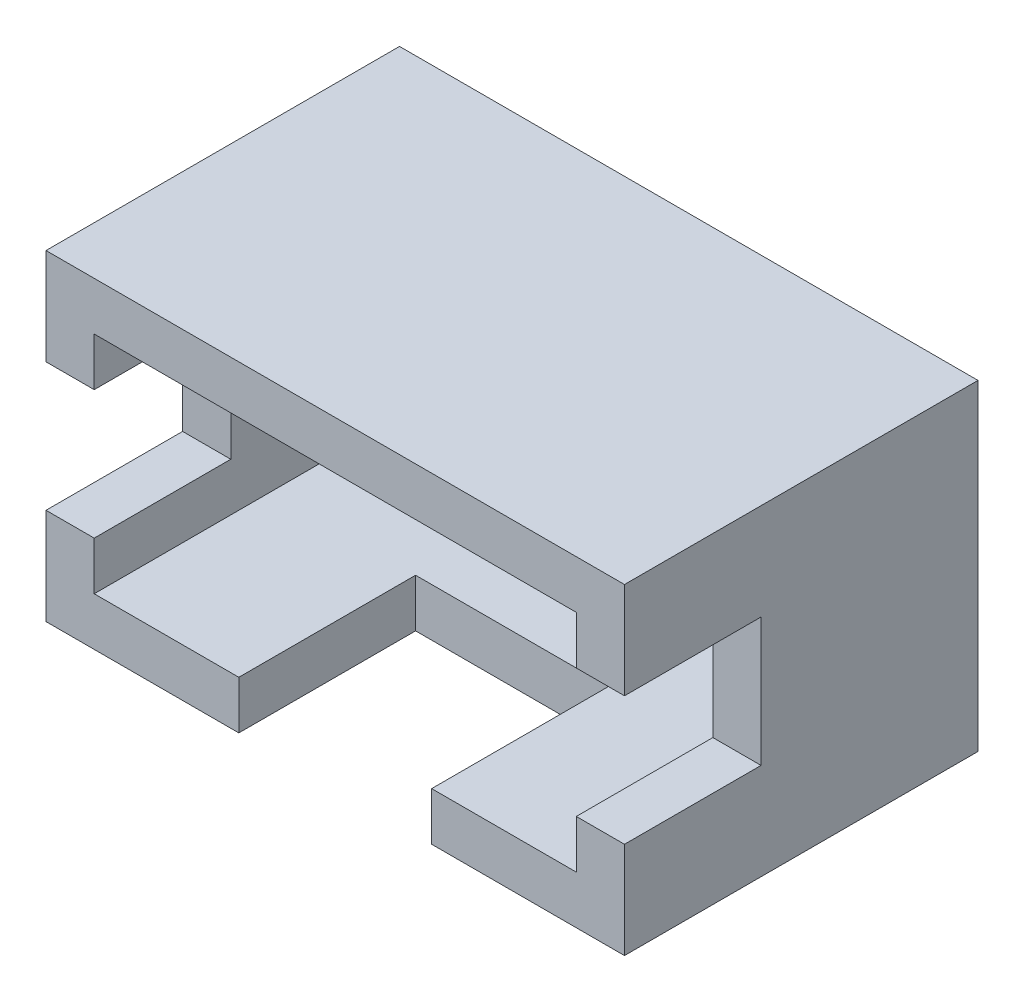
ISO-10303-21;
HEADER;
FILE_DESCRIPTION(('STEP AP214'),'2;1');
FILE_NAME('part.step','',(''),(''),'','','');
FILE_SCHEMA(('AUTOMOTIVE_DESIGN { 1 0 10303 214 1 1 1 1 }'));
ENDSEC;
DATA;
#1=APPLICATION_CONTEXT('core data for automotive mechanical design processes');
#2=APPLICATION_PROTOCOL_DEFINITION('international standard','automotive_design',2000,#1);
#3=PRODUCT_CONTEXT('',#1,'mechanical');
#4=PRODUCT('Part','Part','',(#3));
#5=PRODUCT_RELATED_PRODUCT_CATEGORY('part','',(#4));
#6=PRODUCT_DEFINITION_FORMATION('','',#4);
#7=PRODUCT_DEFINITION_CONTEXT('part definition',#1,'design');
#8=PRODUCT_DEFINITION('design','',#6,#7);
#9=PRODUCT_DEFINITION_SHAPE('','',#8);
#10=(LENGTH_UNIT() NAMED_UNIT(*) SI_UNIT(.MILLI.,.METRE.));
#11=(NAMED_UNIT(*) PLANE_ANGLE_UNIT() SI_UNIT($,.RADIAN.));
#12=(NAMED_UNIT(*) SI_UNIT($,.STERADIAN.) SOLID_ANGLE_UNIT());
#13=UNCERTAINTY_MEASURE_WITH_UNIT(LENGTH_MEASURE(1.E-05),#10,'distance_accuracy_value','');
#14=(GEOMETRIC_REPRESENTATION_CONTEXT(3) GLOBAL_UNCERTAINTY_ASSIGNED_CONTEXT((#13)) GLOBAL_UNIT_ASSIGNED_CONTEXT((#10,
#11,#12)) REPRESENTATION_CONTEXT('',''));
#15=CARTESIAN_POINT('',(0.,0.,0.));
#16=DIRECTION('',(0.,0.,1.));
#17=DIRECTION('',(1.,0.,0.));
#18=AXIS2_PLACEMENT_3D('',#15,#16,#17);
#19=CARTESIAN_POINT('',(0.,0.,22.));
#20=DIRECTION('',(0.,0.,-1.));
#21=DIRECTION('',(-1.,0.,0.));
#22=AXIS2_PLACEMENT_3D('',#19,#20,#21);
#23=PLANE('',#22);
#24=DIRECTION('',(0.,1.,0.));
#25=VECTOR('',#24,1.);
#26=CARTESIAN_POINT('',(-3.,-3.,22.));
#27=LINE('',#26,#25);
#28=CARTESIAN_POINT('',(-3.,11.,22.));
#29=VERTEX_POINT('',#28);
#30=CARTESIAN_POINT('',(-3.,17.,22.));
#31=VERTEX_POINT('',#30);
#32=EDGE_CURVE('E406',#29,#31,#27,.T.);
#33=ORIENTED_EDGE('',*,*,#32,.F.);
#34=DIRECTION('',(-1.,0.,0.));
#35=VECTOR('',#34,1.);
#36=CARTESIAN_POINT('',(-3.,11.,22.));
#37=LINE('',#36,#35);
#38=CARTESIAN_POINT('',(0.,11.,22.));
#39=VERTEX_POINT('',#38);
#40=EDGE_CURVE('E488',#39,#29,#37,.T.);
#41=ORIENTED_EDGE('',*,*,#40,.F.);
#42=DIRECTION('',(0.,1.,0.));
#43=VECTOR('',#42,1.);
#44=CARTESIAN_POINT('',(0.,0.,22.));
#45=LINE('',#44,#43);
#46=CARTESIAN_POINT('',(0.,14.,22.));
#47=VERTEX_POINT('',#46);
#48=EDGE_CURVE('E376',#39,#47,#45,.T.);
#49=ORIENTED_EDGE('',*,*,#48,.T.);
#50=DIRECTION('',(1.,0.,0.));
#51=VECTOR('',#50,1.);
#52=CARTESIAN_POINT('',(0.,14.,22.));
#53=LINE('',#52,#51);
#54=CARTESIAN_POINT('',(30.,14.,22.));
#55=VERTEX_POINT('',#54);
#56=EDGE_CURVE('E373',#47,#55,#53,.T.);
#57=ORIENTED_EDGE('',*,*,#56,.T.);
#58=DIRECTION('',(0.,1.,0.));
#59=VECTOR('',#58,1.);
#60=CARTESIAN_POINT('',(30.,0.,22.));
#61=LINE('',#60,#59);
#62=CARTESIAN_POINT('',(30.,11.,22.));
#63=VERTEX_POINT('',#62);
#64=EDGE_CURVE('E368',#63,#55,#61,.T.);
#65=ORIENTED_EDGE('',*,*,#64,.F.);
#66=CARTESIAN_POINT('',(33.,11.,22.));
#67=VERTEX_POINT('',#66);
#68=EDGE_CURVE('E260',#67,#63,#37,.T.);
#69=ORIENTED_EDGE('',*,*,#68,.F.);
#70=DIRECTION('',(0.,1.,0.));
#71=VECTOR('',#70,1.);
#72=CARTESIAN_POINT('',(33.,-3.,22.));
#73=LINE('',#72,#71);
#74=CARTESIAN_POINT('',(33.,17.,22.));
#75=VERTEX_POINT('',#74);
#76=EDGE_CURVE('E409',#67,#75,#73,.T.);
#77=ORIENTED_EDGE('',*,*,#76,.T.);
#78=DIRECTION('',(1.,0.,0.));
#79=VECTOR('',#78,1.);
#80=CARTESIAN_POINT('',(-3.,17.,22.));
#81=LINE('',#80,#79);
#82=EDGE_CURVE('E405',#31,#75,#81,.T.);
#83=ORIENTED_EDGE('',*,*,#82,.F.);
#84=EDGE_LOOP('',(#33,#41,#49,#57,#65,#69,#77,#83));
#85=FACE_BOUND('',#84,.T.);
#86=ADVANCED_FACE('F60',(#85),#23,.F.);
#87=CARTESIAN_POINT('',(33.,-3.,22.));
#88=VERTEX_POINT('',#87);
#89=CARTESIAN_POINT('',(33.,3.,22.));
#90=VERTEX_POINT('',#89);
#91=EDGE_CURVE('E410',#88,#90,#73,.T.);
#92=ORIENTED_EDGE('',*,*,#91,.T.);
#93=DIRECTION('',(1.,0.,0.));
#94=VECTOR('',#93,1.);
#95=CARTESIAN_POINT('',(-3.,3.,22.));
#96=LINE('',#95,#94);
#97=CARTESIAN_POINT('',(30.,3.,22.));
#98=VERTEX_POINT('',#97);
#99=EDGE_CURVE('E491',#98,#90,#96,.T.);
#100=ORIENTED_EDGE('',*,*,#99,.F.);
#101=CARTESIAN_POINT('',(30.,0.,22.));
#102=VERTEX_POINT('',#101);
#103=EDGE_CURVE('E370',#102,#98,#61,.T.);
#104=ORIENTED_EDGE('',*,*,#103,.F.);
#105=DIRECTION('',(1.,0.,0.));
#106=VECTOR('',#105,1.);
#107=CARTESIAN_POINT('',(0.,0.,22.));
#108=LINE('',#107,#106);
#109=CARTESIAN_POINT('',(21.,0.,22.));
#110=VERTEX_POINT('',#109);
#111=EDGE_CURVE('E369',#110,#102,#108,.T.);
#112=ORIENTED_EDGE('',*,*,#111,.F.);
#113=DIRECTION('',(0.,-1.,0.));
#114=VECTOR('',#113,1.);
#115=CARTESIAN_POINT('',(21.,17.001,22.));
#116=LINE('',#115,#114);
#117=CARTESIAN_POINT('',(21.,-3.,22.));
#118=VERTEX_POINT('',#117);
#119=EDGE_CURVE('E293',#110,#118,#116,.T.);
#120=ORIENTED_EDGE('',*,*,#119,.T.);
#121=DIRECTION('',(1.,0.,0.));
#122=VECTOR('',#121,1.);
#123=CARTESIAN_POINT('',(-3.,-3.,22.));
#124=LINE('',#123,#122);
#125=EDGE_CURVE('E413',#118,#88,#124,.T.);
#126=ORIENTED_EDGE('',*,*,#125,.T.);
#127=EDGE_LOOP('',(#92,#100,#104,#112,#120,#126));
#128=FACE_BOUND('',#127,.T.);
#129=ADVANCED_FACE('F527',(#128),#23,.F.);
#130=CARTESIAN_POINT('',(-3.,-3.,22.));
#131=DIRECTION('',(0.,1.,0.));
#132=DIRECTION('',(0.,0.,1.));
#133=AXIS2_PLACEMENT_3D('',#130,#131,#132);
#134=PLANE('',#133);
#135=ORIENTED_EDGE('',*,*,#125,.F.);
#136=DIRECTION('',(0.,0.,1.));
#137=VECTOR('',#136,1.);
#138=CARTESIAN_POINT('',(21.,-3.,22.));
#139=LINE('',#138,#137);
#140=CARTESIAN_POINT('',(21.,-3.,11.));
#141=VERTEX_POINT('',#140);
#142=EDGE_CURVE('E288',#141,#118,#139,.T.);
#143=ORIENTED_EDGE('',*,*,#142,.F.);
#144=DIRECTION('',(1.,0.,0.));
#145=VECTOR('',#144,1.);
#146=CARTESIAN_POINT('',(21.,-3.,11.));
#147=LINE('',#146,#145);
#148=CARTESIAN_POINT('',(9.00000000000001,-3.,11.));
#149=VERTEX_POINT('',#148);
#150=EDGE_CURVE('E281',#149,#141,#147,.T.);
#151=ORIENTED_EDGE('',*,*,#150,.F.);
#152=DIRECTION('',(0.,0.,-1.));
#153=VECTOR('',#152,1.);
#154=CARTESIAN_POINT('',(9.00000000000001,-3.,22.));
#155=LINE('',#154,#153);
#156=CARTESIAN_POINT('',(9.00000000000001,-3.,22.));
#157=VERTEX_POINT('',#156);
#158=EDGE_CURVE('E285',#157,#149,#155,.T.);
#159=ORIENTED_EDGE('',*,*,#158,.F.);
#160=CARTESIAN_POINT('',(-3.,-3.,22.));
#161=VERTEX_POINT('',#160);
#162=EDGE_CURVE('E414',#161,#157,#124,.T.);
#163=ORIENTED_EDGE('',*,*,#162,.F.);
#164=DIRECTION('',(0.,0.,-1.));
#165=VECTOR('',#164,1.);
#166=CARTESIAN_POINT('',(-3.,-3.,22.));
#167=LINE('',#166,#165);
#168=CARTESIAN_POINT('',(-3.,-3.,0.));
#169=VERTEX_POINT('',#168);
#170=EDGE_CURVE('E430',#161,#169,#167,.T.);
#171=ORIENTED_EDGE('',*,*,#170,.T.);
#172=DIRECTION('',(1.,0.,0.));
#173=VECTOR('',#172,1.);
#174=CARTESIAN_POINT('',(-3.,-3.,0.));
#175=LINE('',#174,#173);
#176=CARTESIAN_POINT('',(14.,-3.,0.));
#177=VERTEX_POINT('',#176);
#178=EDGE_CURVE('E427',#169,#177,#175,.T.);
#179=ORIENTED_EDGE('',*,*,#178,.T.);
#180=DIRECTION('',(0.,0.,-1.));
#181=VECTOR('',#180,1.);
#182=CARTESIAN_POINT('',(14.,-3.,2.));
#183=LINE('',#182,#181);
#184=CARTESIAN_POINT('',(14.,-3.,2.));
#185=VERTEX_POINT('',#184);
#186=EDGE_CURVE('E320',#185,#177,#183,.T.);
#187=ORIENTED_EDGE('',*,*,#186,.F.);
#188=DIRECTION('',(1.,0.,0.));
#189=VECTOR('',#188,1.);
#190=CARTESIAN_POINT('',(14.,-3.,2.));
#191=LINE('',#190,#189);
#192=CARTESIAN_POINT('',(16.,-3.,2.));
#193=VERTEX_POINT('',#192);
#194=EDGE_CURVE('E310',#185,#193,#191,.T.);
#195=ORIENTED_EDGE('',*,*,#194,.T.);
#196=DIRECTION('',(0.,0.,-1.));
#197=VECTOR('',#196,1.);
#198=CARTESIAN_POINT('',(16.,-3.,2.));
#199=LINE('',#198,#197);
#200=CARTESIAN_POINT('',(16.,-3.,0.));
#201=VERTEX_POINT('',#200);
#202=EDGE_CURVE('E333',#193,#201,#199,.T.);
#203=ORIENTED_EDGE('',*,*,#202,.T.);
#204=CARTESIAN_POINT('',(33.,-3.,0.));
#205=VERTEX_POINT('',#204);
#206=EDGE_CURVE('E426',#201,#205,#175,.T.);
#207=ORIENTED_EDGE('',*,*,#206,.T.);
#208=DIRECTION('',(0.,0.,-1.));
#209=VECTOR('',#208,1.);
#210=CARTESIAN_POINT('',(33.,-3.,22.));
#211=LINE('',#210,#209);
#212=EDGE_CURVE('E433',#88,#205,#211,.T.);
#213=ORIENTED_EDGE('',*,*,#212,.F.);
#214=EDGE_LOOP('',(#135,#143,#151,#159,#163,#171,#179,#187,#195,#203,#207,#213));
#215=FACE_BOUND('',#214,.T.);
#216=ADVANCED_FACE('F513',(#215),#134,.F.);
#217=CARTESIAN_POINT('',(0.,0.,22.));
#218=VERTEX_POINT('',#217);
#219=CARTESIAN_POINT('',(0.,3.,22.));
#220=VERTEX_POINT('',#219);
#221=EDGE_CURVE('E377',#218,#220,#45,.T.);
#222=ORIENTED_EDGE('',*,*,#221,.T.);
#223=CARTESIAN_POINT('',(-3.,3.,22.));
#224=VERTEX_POINT('',#223);
#225=EDGE_CURVE('E446',#224,#220,#96,.T.);
#226=ORIENTED_EDGE('',*,*,#225,.F.);
#227=EDGE_CURVE('E264',#161,#224,#27,.T.);
#228=ORIENTED_EDGE('',*,*,#227,.F.);
#229=ORIENTED_EDGE('',*,*,#162,.T.);
#230=DIRECTION('',(0.,-1.,0.));
#231=VECTOR('',#230,1.);
#232=CARTESIAN_POINT('',(9.00000000000001,17.001,22.));
#233=LINE('',#232,#231);
#234=CARTESIAN_POINT('',(9.00000000000001,0.,22.));
#235=VERTEX_POINT('',#234);
#236=EDGE_CURVE('E290',#235,#157,#233,.T.);
#237=ORIENTED_EDGE('',*,*,#236,.F.);
#238=EDGE_CURVE('E365',#218,#235,#108,.T.);
#239=ORIENTED_EDGE('',*,*,#238,.F.);
#240=EDGE_LOOP('',(#222,#226,#228,#229,#237,#239));
#241=FACE_BOUND('',#240,.T.);
#242=ADVANCED_FACE('F445',(#241),#23,.F.);
#243=CARTESIAN_POINT('',(0.,0.,0.));
#244=DIRECTION('',(0.,0.,-1.));
#245=DIRECTION('',(-1.,0.,0.));
#246=AXIS2_PLACEMENT_3D('',#243,#244,#245);
#247=PLANE('',#246);
#248=DIRECTION('',(1.,0.,0.));
#249=VECTOR('',#248,1.);
#250=CARTESIAN_POINT('',(0.,0.,0.));
#251=LINE('',#250,#249);
#252=CARTESIAN_POINT('',(0.,0.,0.));
#253=VERTEX_POINT('',#252);
#254=CARTESIAN_POINT('',(11.,0.,0.));
#255=VERTEX_POINT('',#254);
#256=EDGE_CURVE('E381',#253,#255,#251,.T.);
#257=ORIENTED_EDGE('',*,*,#256,.T.);
#258=DIRECTION('',(0.,1.,0.));
#259=VECTOR('',#258,1.);
#260=CARTESIAN_POINT('',(11.,14.,0.));
#261=LINE('',#260,#259);
#262=CARTESIAN_POINT('',(11.,14.,0.));
#263=VERTEX_POINT('',#262);
#264=EDGE_CURVE('E341',#255,#263,#261,.T.);
#265=ORIENTED_EDGE('',*,*,#264,.T.);
#266=DIRECTION('',(1.,0.,0.));
#267=VECTOR('',#266,1.);
#268=CARTESIAN_POINT('',(0.,14.,0.));
#269=LINE('',#268,#267);
#270=CARTESIAN_POINT('',(0.,14.,0.));
#271=VERTEX_POINT('',#270);
#272=EDGE_CURVE('E388',#271,#263,#269,.T.);
#273=ORIENTED_EDGE('',*,*,#272,.F.);
#274=DIRECTION('',(0.,1.,0.));
#275=VECTOR('',#274,1.);
#276=CARTESIAN_POINT('',(0.,0.,0.));
#277=LINE('',#276,#275);
#278=EDGE_CURVE('E390',#253,#271,#277,.T.);
#279=ORIENTED_EDGE('',*,*,#278,.F.);
#280=EDGE_LOOP('',(#257,#265,#273,#279));
#281=FACE_BOUND('',#280,.T.);
#282=DIRECTION('',(0.,1.,0.));
#283=VECTOR('',#282,1.);
#284=CARTESIAN_POINT('',(-3.,-3.,0.));
#285=LINE('',#284,#283);
#286=CARTESIAN_POINT('',(-3.,17.,0.));
#287=VERTEX_POINT('',#286);
#288=EDGE_CURVE('E403',#169,#287,#285,.T.);
#289=ORIENTED_EDGE('',*,*,#288,.T.);
#290=DIRECTION('',(1.,0.,0.));
#291=VECTOR('',#290,1.);
#292=CARTESIAN_POINT('',(-3.,17.,0.));
#293=LINE('',#292,#291);
#294=CARTESIAN_POINT('',(33.,17.,0.));
#295=VERTEX_POINT('',#294);
#296=EDGE_CURVE('E420',#287,#295,#293,.T.);
#297=ORIENTED_EDGE('',*,*,#296,.T.);
#298=DIRECTION('',(0.,1.,0.));
#299=VECTOR('',#298,1.);
#300=CARTESIAN_POINT('',(33.,-3.,0.));
#301=LINE('',#300,#299);
#302=EDGE_CURVE('E423',#205,#295,#301,.T.);
#303=ORIENTED_EDGE('',*,*,#302,.F.);
#304=ORIENTED_EDGE('',*,*,#206,.F.);
#305=DIRECTION('',(0.,-1.,0.));
#306=VECTOR('',#305,1.);
#307=CARTESIAN_POINT('',(16.,-3.,0.));
#308=LINE('',#307,#306);
#309=CARTESIAN_POINT('',(16.,-5.,0.));
#310=VERTEX_POINT('',#309);
#311=EDGE_CURVE('E323',#201,#310,#308,.T.);
#312=ORIENTED_EDGE('',*,*,#311,.T.);
#313=DIRECTION('',(-1.,0.,0.));
#314=VECTOR('',#313,1.);
#315=CARTESIAN_POINT('',(14.,-5.,0.));
#316=LINE('',#315,#314);
#317=CARTESIAN_POINT('',(14.,-5.,0.));
#318=VERTEX_POINT('',#317);
#319=EDGE_CURVE('E311',#310,#318,#316,.T.);
#320=ORIENTED_EDGE('',*,*,#319,.T.);
#321=DIRECTION('',(0.,1.,0.));
#322=VECTOR('',#321,1.);
#323=CARTESIAN_POINT('',(14.,-3.,0.));
#324=LINE('',#323,#322);
#325=EDGE_CURVE('E284',#318,#177,#324,.T.);
#326=ORIENTED_EDGE('',*,*,#325,.T.);
#327=ORIENTED_EDGE('',*,*,#178,.F.);
#328=EDGE_LOOP('',(#289,#297,#303,#304,#312,#320,#326,#327));
#329=FACE_BOUND('',#328,.T.);
#330=DIRECTION('',(0.,-1.,0.));
#331=VECTOR('',#330,1.);
#332=CARTESIAN_POINT('',(20.,14.,0.));
#333=LINE('',#332,#331);
#334=CARTESIAN_POINT('',(20.,14.,0.));
#335=VERTEX_POINT('',#334);
#336=CARTESIAN_POINT('',(20.,0.,0.));
#337=VERTEX_POINT('',#336);
#338=EDGE_CURVE('E330',#335,#337,#333,.T.);
#339=ORIENTED_EDGE('',*,*,#338,.T.);
#340=CARTESIAN_POINT('',(30.,0.,0.));
#341=VERTEX_POINT('',#340);
#342=EDGE_CURVE('E356',#337,#341,#251,.T.);
#343=ORIENTED_EDGE('',*,*,#342,.T.);
#344=DIRECTION('',(0.,1.,0.));
#345=VECTOR('',#344,1.);
#346=CARTESIAN_POINT('',(30.,0.,0.));
#347=LINE('',#346,#345);
#348=CARTESIAN_POINT('',(30.,14.,0.));
#349=VERTEX_POINT('',#348);
#350=EDGE_CURVE('E384',#341,#349,#347,.T.);
#351=ORIENTED_EDGE('',*,*,#350,.T.);
#352=EDGE_CURVE('E387',#335,#349,#269,.T.);
#353=ORIENTED_EDGE('',*,*,#352,.F.);
#354=EDGE_LOOP('',(#339,#343,#351,#353));
#355=FACE_BOUND('',#354,.T.);
#356=ADVANCED_FACE('F454',(#281,#329,#355),#247,.T.);
#357=CARTESIAN_POINT('',(-3.,-3.,22.));
#358=DIRECTION('',(-1.,0.,0.));
#359=DIRECTION('',(0.,0.,1.));
#360=AXIS2_PLACEMENT_3D('',#357,#358,#359);
#361=PLANE('',#360);
#362=DIRECTION('',(0.,0.,1.));
#363=VECTOR('',#362,1.);
#364=CARTESIAN_POINT('',(-3.,11.,13.5));
#365=LINE('',#364,#363);
#366=CARTESIAN_POINT('',(-3.,11.,13.5));
#367=VERTEX_POINT('',#366);
#368=EDGE_CURVE('E276',#367,#29,#365,.T.);
#369=ORIENTED_EDGE('',*,*,#368,.T.);
#370=ORIENTED_EDGE('',*,*,#32,.T.);
#371=DIRECTION('',(0.,0.,-1.));
#372=VECTOR('',#371,1.);
#373=CARTESIAN_POINT('',(-3.,17.,22.));
#374=LINE('',#373,#372);
#375=EDGE_CURVE('E417',#31,#287,#374,.T.);
#376=ORIENTED_EDGE('',*,*,#375,.T.);
#377=ORIENTED_EDGE('',*,*,#288,.F.);
#378=ORIENTED_EDGE('',*,*,#170,.F.);
#379=ORIENTED_EDGE('',*,*,#227,.T.);
#380=DIRECTION('',(0.,0.,1.));
#381=VECTOR('',#380,1.);
#382=CARTESIAN_POINT('',(-3.,3.,13.5));
#383=LINE('',#382,#381);
#384=CARTESIAN_POINT('',(-3.,3.,13.5));
#385=VERTEX_POINT('',#384);
#386=EDGE_CURVE('E245',#385,#224,#383,.T.);
#387=ORIENTED_EDGE('',*,*,#386,.F.);
#388=DIRECTION('',(0.,-1.,0.));
#389=VECTOR('',#388,1.);
#390=CARTESIAN_POINT('',(-3.,3.,13.5));
#391=LINE('',#390,#389);
#392=EDGE_CURVE('E253',#367,#385,#391,.T.);
#393=ORIENTED_EDGE('',*,*,#392,.F.);
#394=EDGE_LOOP('',(#369,#370,#376,#377,#378,#379,#387,#393));
#395=FACE_BOUND('',#394,.T.);
#396=ADVANCED_FACE('F62',(#395),#361,.T.);
#397=CARTESIAN_POINT('',(33.,-3.,22.));
#398=DIRECTION('',(-1.,0.,0.));
#399=DIRECTION('',(0.,-1.,0.));
#400=AXIS2_PLACEMENT_3D('',#397,#398,#399);
#401=PLANE('',#400);
#402=ORIENTED_EDGE('',*,*,#76,.F.);
#403=DIRECTION('',(0.,0.,1.));
#404=VECTOR('',#403,1.);
#405=CARTESIAN_POINT('',(33.,11.,13.5));
#406=LINE('',#405,#404);
#407=CARTESIAN_POINT('',(33.,11.,13.5));
#408=VERTEX_POINT('',#407);
#409=EDGE_CURVE('E268',#408,#67,#406,.T.);
#410=ORIENTED_EDGE('',*,*,#409,.F.);
#411=DIRECTION('',(0.,1.,0.));
#412=VECTOR('',#411,1.);
#413=CARTESIAN_POINT('',(33.,3.,13.5));
#414=LINE('',#413,#412);
#415=CARTESIAN_POINT('',(33.,3.,13.5));
#416=VERTEX_POINT('',#415);
#417=EDGE_CURVE('E249',#416,#408,#414,.T.);
#418=ORIENTED_EDGE('',*,*,#417,.F.);
#419=DIRECTION('',(0.,0.,1.));
#420=VECTOR('',#419,1.);
#421=CARTESIAN_POINT('',(33.,3.,13.5));
#422=LINE('',#421,#420);
#423=EDGE_CURVE('E265',#416,#90,#422,.T.);
#424=ORIENTED_EDGE('',*,*,#423,.T.);
#425=ORIENTED_EDGE('',*,*,#91,.F.);
#426=ORIENTED_EDGE('',*,*,#212,.T.);
#427=ORIENTED_EDGE('',*,*,#302,.T.);
#428=DIRECTION('',(0.,0.,-1.));
#429=VECTOR('',#428,1.);
#430=CARTESIAN_POINT('',(33.,17.,22.));
#431=LINE('',#430,#429);
#432=EDGE_CURVE('E436',#75,#295,#431,.T.);
#433=ORIENTED_EDGE('',*,*,#432,.F.);
#434=EDGE_LOOP('',(#402,#410,#418,#424,#425,#426,#427,#433));
#435=FACE_BOUND('',#434,.T.);
#436=ADVANCED_FACE('F499',(#435),#401,.F.);
#437=CARTESIAN_POINT('',(-3.,17.,22.));
#438=DIRECTION('',(0.,1.,0.));
#439=DIRECTION('',(0.,0.,1.));
#440=AXIS2_PLACEMENT_3D('',#437,#438,#439);
#441=PLANE('',#440);
#442=ORIENTED_EDGE('',*,*,#296,.F.);
#443=ORIENTED_EDGE('',*,*,#375,.F.);
#444=ORIENTED_EDGE('',*,*,#82,.T.);
#445=ORIENTED_EDGE('',*,*,#432,.T.);
#446=EDGE_LOOP('',(#442,#443,#444,#445));
#447=FACE_BOUND('',#446,.T.);
#448=ADVANCED_FACE('F504',(#447),#441,.T.);
#449=CARTESIAN_POINT('',(0.,0.,22.));
#450=DIRECTION('',(0.,1.,0.));
#451=DIRECTION('',(0.,0.,1.));
#452=AXIS2_PLACEMENT_3D('',#449,#450,#451);
#453=PLANE('',#452);
#454=DIRECTION('',(0.,0.,1.));
#455=VECTOR('',#454,1.);
#456=CARTESIAN_POINT('',(21.,0.,22.));
#457=LINE('',#456,#455);
#458=CARTESIAN_POINT('',(21.,0.,11.));
#459=VERTEX_POINT('',#458);
#460=EDGE_CURVE('E280',#459,#110,#457,.T.);
#461=ORIENTED_EDGE('',*,*,#460,.T.);
#462=ORIENTED_EDGE('',*,*,#111,.T.);
#463=DIRECTION('',(0.,0.,-1.));
#464=VECTOR('',#463,1.);
#465=CARTESIAN_POINT('',(30.,0.,22.));
#466=LINE('',#465,#464);
#467=EDGE_CURVE('E400',#102,#341,#466,.T.);
#468=ORIENTED_EDGE('',*,*,#467,.T.);
#469=ORIENTED_EDGE('',*,*,#342,.F.);
#470=DIRECTION('',(0.,0.,-1.));
#471=VECTOR('',#470,1.);
#472=CARTESIAN_POINT('',(20.,0.,4.5));
#473=LINE('',#472,#471);
#474=CARTESIAN_POINT('',(20.,0.,4.5));
#475=VERTEX_POINT('',#474);
#476=EDGE_CURVE('E349',#475,#337,#473,.T.);
#477=ORIENTED_EDGE('',*,*,#476,.F.);
#478=DIRECTION('',(-1.,0.,0.));
#479=VECTOR('',#478,1.);
#480=CARTESIAN_POINT('',(20.,0.,4.5));
#481=LINE('',#480,#479);
#482=CARTESIAN_POINT('',(11.,0.,4.5));
#483=VERTEX_POINT('',#482);
#484=EDGE_CURVE('E340',#475,#483,#481,.T.);
#485=ORIENTED_EDGE('',*,*,#484,.T.);
#486=DIRECTION('',(0.,0.,-1.));
#487=VECTOR('',#486,1.);
#488=CARTESIAN_POINT('',(11.,0.,4.5));
#489=LINE('',#488,#487);
#490=EDGE_CURVE('E360',#483,#255,#489,.T.);
#491=ORIENTED_EDGE('',*,*,#490,.T.);
#492=ORIENTED_EDGE('',*,*,#256,.F.);
#493=DIRECTION('',(0.,0.,-1.));
#494=VECTOR('',#493,1.);
#495=CARTESIAN_POINT('',(0.,0.,22.));
#496=LINE('',#495,#494);
#497=EDGE_CURVE('E380',#218,#253,#496,.T.);
#498=ORIENTED_EDGE('',*,*,#497,.F.);
#499=ORIENTED_EDGE('',*,*,#238,.T.);
#500=DIRECTION('',(0.,0.,-1.));
#501=VECTOR('',#500,1.);
#502=CARTESIAN_POINT('',(9.00000000000001,0.,22.));
#503=LINE('',#502,#501);
#504=CARTESIAN_POINT('',(9.00000000000001,0.,11.));
#505=VERTEX_POINT('',#504);
#506=EDGE_CURVE('E298',#235,#505,#503,.T.);
#507=ORIENTED_EDGE('',*,*,#506,.T.);
#508=DIRECTION('',(1.,0.,0.));
#509=VECTOR('',#508,1.);
#510=CARTESIAN_POINT('',(21.,0.,11.));
#511=LINE('',#510,#509);
#512=EDGE_CURVE('E294',#505,#459,#511,.T.);
#513=ORIENTED_EDGE('',*,*,#512,.T.);
#514=EDGE_LOOP('',(#461,#462,#468,#469,#477,#485,#491,#492,#498,#499,#507,#513));
#515=FACE_BOUND('',#514,.T.);
#516=ADVANCED_FACE('F449',(#515),#453,.T.);
#517=CARTESIAN_POINT('',(30.,0.,22.));
#518=DIRECTION('',(-1.,0.,0.));
#519=DIRECTION('',(0.,-1.,0.));
#520=AXIS2_PLACEMENT_3D('',#517,#518,#519);
#521=PLANE('',#520);
#522=DIRECTION('',(0.,0.,-1.));
#523=VECTOR('',#522,1.);
#524=CARTESIAN_POINT('',(30.,11.,22.));
#525=LINE('',#524,#523);
#526=CARTESIAN_POINT('',(30.,11.,13.5));
#527=VERTEX_POINT('',#526);
#528=EDGE_CURVE('E278',#63,#527,#525,.T.);
#529=ORIENTED_EDGE('',*,*,#528,.F.);
#530=ORIENTED_EDGE('',*,*,#64,.T.);
#531=DIRECTION('',(0.,0.,-1.));
#532=VECTOR('',#531,1.);
#533=CARTESIAN_POINT('',(30.,14.,22.));
#534=LINE('',#533,#532);
#535=EDGE_CURVE('E397',#55,#349,#534,.T.);
#536=ORIENTED_EDGE('',*,*,#535,.T.);
#537=ORIENTED_EDGE('',*,*,#350,.F.);
#538=ORIENTED_EDGE('',*,*,#467,.F.);
#539=ORIENTED_EDGE('',*,*,#103,.T.);
#540=DIRECTION('',(0.,0.,1.));
#541=VECTOR('',#540,1.);
#542=CARTESIAN_POINT('',(30.,3.,22.));
#543=LINE('',#542,#541);
#544=CARTESIAN_POINT('',(30.,3.,13.5));
#545=VERTEX_POINT('',#544);
#546=EDGE_CURVE('E275',#545,#98,#543,.T.);
#547=ORIENTED_EDGE('',*,*,#546,.F.);
#548=DIRECTION('',(0.,-1.,0.));
#549=VECTOR('',#548,1.);
#550=CARTESIAN_POINT('',(30.,0.,13.5));
#551=LINE('',#550,#549);
#552=EDGE_CURVE('E273',#527,#545,#551,.T.);
#553=ORIENTED_EDGE('',*,*,#552,.F.);
#554=EDGE_LOOP('',(#529,#530,#536,#537,#538,#539,#547,#553));
#555=FACE_BOUND('',#554,.T.);
#556=ADVANCED_FACE('F477',(#555),#521,.T.);
#557=CARTESIAN_POINT('',(0.,14.,22.));
#558=DIRECTION('',(0.,1.,0.));
#559=DIRECTION('',(0.,0.,1.));
#560=AXIS2_PLACEMENT_3D('',#557,#558,#559);
#561=PLANE('',#560);
#562=DIRECTION('',(1.,0.,0.));
#563=VECTOR('',#562,1.);
#564=CARTESIAN_POINT('',(20.,14.,4.5));
#565=LINE('',#564,#563);
#566=CARTESIAN_POINT('',(11.,14.,4.5));
#567=VERTEX_POINT('',#566);
#568=CARTESIAN_POINT('',(20.,14.,4.5));
#569=VERTEX_POINT('',#568);
#570=EDGE_CURVE('E347',#567,#569,#565,.T.);
#571=ORIENTED_EDGE('',*,*,#570,.T.);
#572=DIRECTION('',(0.,0.,-1.));
#573=VECTOR('',#572,1.);
#574=CARTESIAN_POINT('',(20.,14.,4.5));
#575=LINE('',#574,#573);
#576=EDGE_CURVE('E353',#569,#335,#575,.T.);
#577=ORIENTED_EDGE('',*,*,#576,.T.);
#578=ORIENTED_EDGE('',*,*,#352,.T.);
#579=ORIENTED_EDGE('',*,*,#535,.F.);
#580=ORIENTED_EDGE('',*,*,#56,.F.);
#581=DIRECTION('',(0.,0.,-1.));
#582=VECTOR('',#581,1.);
#583=CARTESIAN_POINT('',(0.,14.,22.));
#584=LINE('',#583,#582);
#585=EDGE_CURVE('E395',#47,#271,#584,.T.);
#586=ORIENTED_EDGE('',*,*,#585,.T.);
#587=ORIENTED_EDGE('',*,*,#272,.T.);
#588=DIRECTION('',(0.,0.,-1.));
#589=VECTOR('',#588,1.);
#590=CARTESIAN_POINT('',(11.,14.,4.5));
#591=LINE('',#590,#589);
#592=EDGE_CURVE('E357',#567,#263,#591,.T.);
#593=ORIENTED_EDGE('',*,*,#592,.F.);
#594=EDGE_LOOP('',(#571,#577,#578,#579,#580,#586,#587,#593));
#595=FACE_BOUND('',#594,.T.);
#596=ADVANCED_FACE('F457',(#595),#561,.F.);
#597=CARTESIAN_POINT('',(0.,0.,22.));
#598=DIRECTION('',(-1.,0.,0.));
#599=DIRECTION('',(0.,0.,1.));
#600=AXIS2_PLACEMENT_3D('',#597,#598,#599);
#601=PLANE('',#600);
#602=ORIENTED_EDGE('',*,*,#48,.F.);
#603=DIRECTION('',(0.,0.,-1.));
#604=VECTOR('',#603,1.);
#605=CARTESIAN_POINT('',(0.,11.,22.));
#606=LINE('',#605,#604);
#607=CARTESIAN_POINT('',(0.,11.,13.5));
#608=VERTEX_POINT('',#607);
#609=EDGE_CURVE('E12',#39,#608,#606,.T.);
#610=ORIENTED_EDGE('',*,*,#609,.T.);
#611=DIRECTION('',(0.,-1.,0.));
#612=VECTOR('',#611,1.);
#613=CARTESIAN_POINT('',(0.,0.,13.5));
#614=LINE('',#613,#612);
#615=CARTESIAN_POINT('',(0.,3.,13.5));
#616=VERTEX_POINT('',#615);
#617=EDGE_CURVE('E432',#608,#616,#614,.T.);
#618=ORIENTED_EDGE('',*,*,#617,.T.);
#619=DIRECTION('',(0.,0.,1.));
#620=VECTOR('',#619,1.);
#621=CARTESIAN_POINT('',(0.,3.,22.));
#622=LINE('',#621,#620);
#623=EDGE_CURVE('E68',#616,#220,#622,.T.);
#624=ORIENTED_EDGE('',*,*,#623,.T.);
#625=ORIENTED_EDGE('',*,*,#221,.F.);
#626=ORIENTED_EDGE('',*,*,#497,.T.);
#627=ORIENTED_EDGE('',*,*,#278,.T.);
#628=ORIENTED_EDGE('',*,*,#585,.F.);
#629=EDGE_LOOP('',(#602,#610,#618,#624,#625,#626,#627,#628));
#630=FACE_BOUND('',#629,.T.);
#631=ADVANCED_FACE('F442',(#630),#601,.F.);
#632=CARTESIAN_POINT('',(20.,14.,4.5));
#633=DIRECTION('',(1.,0.,0.));
#634=DIRECTION('',(0.,1.,0.));
#635=AXIS2_PLACEMENT_3D('',#632,#633,#634);
#636=PLANE('',#635);
#637=ORIENTED_EDGE('',*,*,#338,.F.);
#638=ORIENTED_EDGE('',*,*,#576,.F.);
#639=DIRECTION('',(0.,-1.,0.));
#640=VECTOR('',#639,1.);
#641=CARTESIAN_POINT('',(20.,14.,4.5));
#642=LINE('',#641,#640);
#643=EDGE_CURVE('E337',#569,#475,#642,.T.);
#644=ORIENTED_EDGE('',*,*,#643,.T.);
#645=ORIENTED_EDGE('',*,*,#476,.T.);
#646=EDGE_LOOP('',(#637,#638,#644,#645));
#647=FACE_BOUND('',#646,.T.);
#648=ADVANCED_FACE('F469',(#647),#636,.T.);
#649=CARTESIAN_POINT('',(11.,14.,4.5));
#650=DIRECTION('',(-1.,0.,0.));
#651=DIRECTION('',(0.,-1.,0.));
#652=AXIS2_PLACEMENT_3D('',#649,#650,#651);
#653=PLANE('',#652);
#654=ORIENTED_EDGE('',*,*,#264,.F.);
#655=ORIENTED_EDGE('',*,*,#490,.F.);
#656=DIRECTION('',(0.,1.,0.));
#657=VECTOR('',#656,1.);
#658=CARTESIAN_POINT('',(11.,14.,4.5));
#659=LINE('',#658,#657);
#660=EDGE_CURVE('E344',#483,#567,#659,.T.);
#661=ORIENTED_EDGE('',*,*,#660,.T.);
#662=ORIENTED_EDGE('',*,*,#592,.T.);
#663=EDGE_LOOP('',(#654,#655,#661,#662));
#664=FACE_BOUND('',#663,.T.);
#665=ADVANCED_FACE('F460',(#664),#653,.T.);
#666=CARTESIAN_POINT('',(0.,0.,4.5));
#667=DIRECTION('',(0.,0.,-1.));
#668=DIRECTION('',(-1.,0.,0.));
#669=AXIS2_PLACEMENT_3D('',#666,#667,#668);
#670=PLANE('',#669);
#671=ORIENTED_EDGE('',*,*,#643,.F.);
#672=ORIENTED_EDGE('',*,*,#570,.F.);
#673=ORIENTED_EDGE('',*,*,#660,.F.);
#674=ORIENTED_EDGE('',*,*,#484,.F.);
#675=EDGE_LOOP('',(#671,#672,#673,#674));
#676=FACE_BOUND('',#675,.T.);
#677=ADVANCED_FACE('F465',(#676),#670,.F.);
#678=CARTESIAN_POINT('',(14.,-3.,2.));
#679=DIRECTION('',(-1.,0.,0.));
#680=DIRECTION('',(0.,0.,1.));
#681=AXIS2_PLACEMENT_3D('',#678,#679,#680);
#682=PLANE('',#681);
#683=ORIENTED_EDGE('',*,*,#325,.F.);
#684=DIRECTION('',(0.,0.,-1.));
#685=VECTOR('',#684,1.);
#686=CARTESIAN_POINT('',(14.,-5.,2.));
#687=LINE('',#686,#685);
#688=CARTESIAN_POINT('',(14.,-5.,2.));
#689=VERTEX_POINT('',#688);
#690=EDGE_CURVE('E328',#689,#318,#687,.T.);
#691=ORIENTED_EDGE('',*,*,#690,.F.);
#692=DIRECTION('',(0.,1.,0.));
#693=VECTOR('',#692,1.);
#694=CARTESIAN_POINT('',(14.,-3.,2.));
#695=LINE('',#694,#693);
#696=EDGE_CURVE('E307',#689,#185,#695,.T.);
#697=ORIENTED_EDGE('',*,*,#696,.T.);
#698=ORIENTED_EDGE('',*,*,#186,.T.);
#699=EDGE_LOOP('',(#683,#691,#697,#698));
#700=FACE_BOUND('',#699,.T.);
#701=ADVANCED_FACE('F580',(#700),#682,.T.);
#702=CARTESIAN_POINT('',(14.,-5.,2.));
#703=DIRECTION('',(0.,-1.,0.));
#704=DIRECTION('',(0.,0.,-1.));
#705=AXIS2_PLACEMENT_3D('',#702,#703,#704);
#706=PLANE('',#705);
#707=ORIENTED_EDGE('',*,*,#319,.F.);
#708=DIRECTION('',(0.,0.,-1.));
#709=VECTOR('',#708,1.);
#710=CARTESIAN_POINT('',(16.,-5.,2.));
#711=LINE('',#710,#709);
#712=CARTESIAN_POINT('',(16.,-5.,2.));
#713=VERTEX_POINT('',#712);
#714=EDGE_CURVE('E331',#713,#310,#711,.T.);
#715=ORIENTED_EDGE('',*,*,#714,.F.);
#716=DIRECTION('',(-1.,0.,0.));
#717=VECTOR('',#716,1.);
#718=CARTESIAN_POINT('',(14.,-5.,2.));
#719=LINE('',#718,#717);
#720=EDGE_CURVE('E317',#713,#689,#719,.T.);
#721=ORIENTED_EDGE('',*,*,#720,.T.);
#722=ORIENTED_EDGE('',*,*,#690,.T.);
#723=EDGE_LOOP('',(#707,#715,#721,#722));
#724=FACE_BOUND('',#723,.T.);
#725=ADVANCED_FACE('F583',(#724),#706,.T.);
#726=CARTESIAN_POINT('',(16.,-3.,2.));
#727=DIRECTION('',(1.,0.,0.));
#728=DIRECTION('',(0.,1.,0.));
#729=AXIS2_PLACEMENT_3D('',#726,#727,#728);
#730=PLANE('',#729);
#731=ORIENTED_EDGE('',*,*,#311,.F.);
#732=ORIENTED_EDGE('',*,*,#202,.F.);
#733=DIRECTION('',(0.,-1.,0.));
#734=VECTOR('',#733,1.);
#735=CARTESIAN_POINT('',(16.,-3.,2.));
#736=LINE('',#735,#734);
#737=EDGE_CURVE('E314',#193,#713,#736,.T.);
#738=ORIENTED_EDGE('',*,*,#737,.T.);
#739=ORIENTED_EDGE('',*,*,#714,.T.);
#740=EDGE_LOOP('',(#731,#732,#738,#739));
#741=FACE_BOUND('',#740,.T.);
#742=ADVANCED_FACE('F585',(#741),#730,.T.);
#743=CARTESIAN_POINT('',(0.,0.,2.));
#744=DIRECTION('',(0.,0.,1.));
#745=DIRECTION('',(1.,0.,0.));
#746=AXIS2_PLACEMENT_3D('',#743,#744,#745);
#747=PLANE('',#746);
#748=ORIENTED_EDGE('',*,*,#696,.F.);
#749=ORIENTED_EDGE('',*,*,#720,.F.);
#750=ORIENTED_EDGE('',*,*,#737,.F.);
#751=ORIENTED_EDGE('',*,*,#194,.F.);
#752=EDGE_LOOP('',(#748,#749,#750,#751));
#753=FACE_BOUND('',#752,.T.);
#754=ADVANCED_FACE('F588',(#753),#747,.T.);
#755=CARTESIAN_POINT('',(21.,17.001,22.));
#756=DIRECTION('',(1.,0.,0.));
#757=DIRECTION('',(0.,0.,-1.));
#758=AXIS2_PLACEMENT_3D('',#755,#756,#757);
#759=PLANE('',#758);
#760=DIRECTION('',(0.,-1.,0.));
#761=VECTOR('',#760,1.);
#762=CARTESIAN_POINT('',(21.,17.001,11.));
#763=LINE('',#762,#761);
#764=EDGE_CURVE('E297',#459,#141,#763,.T.);
#765=ORIENTED_EDGE('',*,*,#764,.T.);
#766=ORIENTED_EDGE('',*,*,#142,.T.);
#767=ORIENTED_EDGE('',*,*,#119,.F.);
#768=ORIENTED_EDGE('',*,*,#460,.F.);
#769=EDGE_LOOP('',(#765,#766,#767,#768));
#770=FACE_BOUND('',#769,.T.);
#771=ADVANCED_FACE('F595',(#770),#759,.F.);
#772=CARTESIAN_POINT('',(21.,17.001,11.));
#773=DIRECTION('',(0.,0.,-1.));
#774=DIRECTION('',(-1.,0.,0.));
#775=AXIS2_PLACEMENT_3D('',#772,#773,#774);
#776=PLANE('',#775);
#777=DIRECTION('',(0.,-1.,0.));
#778=VECTOR('',#777,1.);
#779=CARTESIAN_POINT('',(9.00000000000001,17.001,11.));
#780=LINE('',#779,#778);
#781=EDGE_CURVE('E301',#505,#149,#780,.T.);
#782=ORIENTED_EDGE('',*,*,#781,.T.);
#783=ORIENTED_EDGE('',*,*,#150,.T.);
#784=ORIENTED_EDGE('',*,*,#764,.F.);
#785=ORIENTED_EDGE('',*,*,#512,.F.);
#786=EDGE_LOOP('',(#782,#783,#784,#785));
#787=FACE_BOUND('',#786,.T.);
#788=ADVANCED_FACE('F522',(#787),#776,.F.);
#789=CARTESIAN_POINT('',(9.00000000000001,17.001,22.));
#790=DIRECTION('',(-1.,0.,0.));
#791=DIRECTION('',(0.,0.,1.));
#792=AXIS2_PLACEMENT_3D('',#789,#790,#791);
#793=PLANE('',#792);
#794=ORIENTED_EDGE('',*,*,#236,.T.);
#795=ORIENTED_EDGE('',*,*,#158,.T.);
#796=ORIENTED_EDGE('',*,*,#781,.F.);
#797=ORIENTED_EDGE('',*,*,#506,.F.);
#798=EDGE_LOOP('',(#794,#795,#796,#797));
#799=FACE_BOUND('',#798,.T.);
#800=ADVANCED_FACE('F518',(#799),#793,.F.);
#801=CARTESIAN_POINT('',(0.,0.,13.5));
#802=DIRECTION('',(0.,0.,-1.));
#803=DIRECTION('',(-1.,0.,0.));
#804=AXIS2_PLACEMENT_3D('',#801,#802,#803);
#805=PLANE('',#804);
#806=DIRECTION('',(-1.,0.,0.));
#807=VECTOR('',#806,1.);
#808=CARTESIAN_POINT('',(-3.,11.,13.5));
#809=LINE('',#808,#807);
#810=EDGE_CURVE('E256',#608,#367,#809,.T.);
#811=ORIENTED_EDGE('',*,*,#810,.T.);
#812=ORIENTED_EDGE('',*,*,#392,.T.);
#813=DIRECTION('',(1.,0.,0.));
#814=VECTOR('',#813,1.);
#815=CARTESIAN_POINT('',(-3.,3.,13.5));
#816=LINE('',#815,#814);
#817=EDGE_CURVE('E83',#385,#616,#816,.T.);
#818=ORIENTED_EDGE('',*,*,#817,.T.);
#819=ORIENTED_EDGE('',*,*,#617,.F.);
#820=EDGE_LOOP('',(#811,#812,#818,#819));
#821=FACE_BOUND('',#820,.T.);
#822=ADVANCED_FACE('F254',(#821),#805,.F.);
#823=CARTESIAN_POINT('',(-3.,3.,13.5));
#824=DIRECTION('',(0.,-1.,0.));
#825=DIRECTION('',(0.,0.,-1.));
#826=AXIS2_PLACEMENT_3D('',#823,#824,#825);
#827=PLANE('',#826);
#828=ORIENTED_EDGE('',*,*,#817,.F.);
#829=ORIENTED_EDGE('',*,*,#386,.T.);
#830=ORIENTED_EDGE('',*,*,#225,.T.);
#831=ORIENTED_EDGE('',*,*,#623,.F.);
#832=EDGE_LOOP('',(#828,#829,#830,#831));
#833=FACE_BOUND('',#832,.T.);
#834=ADVANCED_FACE('F243',(#833),#827,.F.);
#835=CARTESIAN_POINT('',(-3.,11.,13.5));
#836=DIRECTION('',(0.,1.,0.));
#837=DIRECTION('',(-1.,0.,0.));
#838=AXIS2_PLACEMENT_3D('',#835,#836,#837);
#839=PLANE('',#838);
#840=ORIENTED_EDGE('',*,*,#40,.T.);
#841=ORIENTED_EDGE('',*,*,#368,.F.);
#842=ORIENTED_EDGE('',*,*,#810,.F.);
#843=ORIENTED_EDGE('',*,*,#609,.F.);
#844=EDGE_LOOP('',(#840,#841,#842,#843));
#845=FACE_BOUND('',#844,.T.);
#846=ADVANCED_FACE('F487',(#845),#839,.F.);
#847=ORIENTED_EDGE('',*,*,#528,.T.);
#848=EDGE_CURVE('E75',#408,#527,#809,.T.);
#849=ORIENTED_EDGE('',*,*,#848,.F.);
#850=ORIENTED_EDGE('',*,*,#409,.T.);
#851=ORIENTED_EDGE('',*,*,#68,.T.);
#852=EDGE_LOOP('',(#847,#849,#850,#851));
#853=FACE_BOUND('',#852,.T.);
#854=ADVANCED_FACE('F496',(#853),#839,.F.);
#855=ORIENTED_EDGE('',*,*,#546,.T.);
#856=ORIENTED_EDGE('',*,*,#99,.T.);
#857=ORIENTED_EDGE('',*,*,#423,.F.);
#858=EDGE_CURVE('E250',#545,#416,#816,.T.);
#859=ORIENTED_EDGE('',*,*,#858,.F.);
#860=EDGE_LOOP('',(#855,#856,#857,#859));
#861=FACE_BOUND('',#860,.T.);
#862=ADVANCED_FACE('F532',(#861),#827,.F.);
#863=ORIENTED_EDGE('',*,*,#552,.T.);
#864=ORIENTED_EDGE('',*,*,#858,.T.);
#865=ORIENTED_EDGE('',*,*,#417,.T.);
#866=ORIENTED_EDGE('',*,*,#848,.T.);
#867=EDGE_LOOP('',(#863,#864,#865,#866));
#868=FACE_BOUND('',#867,.T.);
#869=ADVANCED_FACE('F535',(#868),#805,.F.);
#870=CLOSED_SHELL('',(#86,#129,#216,#242,#356,#396,#436,#448,#516,#556,#596,#631,#648,#665,#677,
#701,#725,#742,#754,#771,#788,#800,#822,#834,#846,#854,#862,#869));
#871=MANIFOLD_SOLID_BREP('B2',#870);
#872=ADVANCED_BREP_SHAPE_REPRESENTATION('',(#18,#871),#14);
#873=SHAPE_DEFINITION_REPRESENTATION(#9,#872);
ENDSEC;
END-ISO-10303-21;
